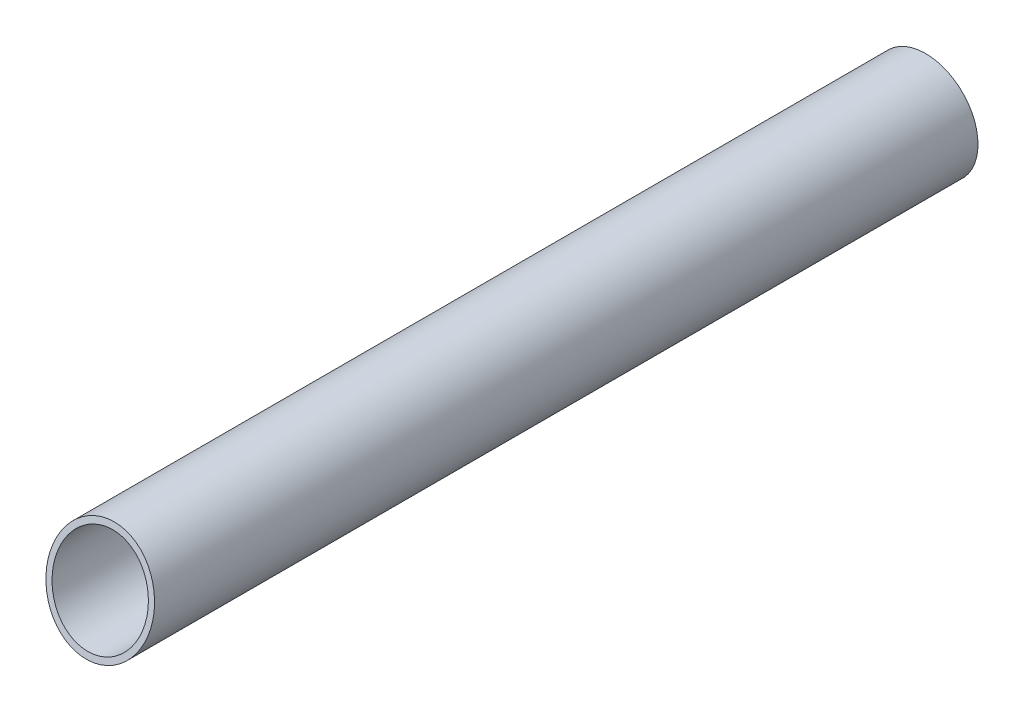
ISO-10303-21;
HEADER;
FILE_DESCRIPTION(('STEP AP214'),'2;1');
FILE_NAME('part.step','',(''),(''),'','','');
FILE_SCHEMA(('AUTOMOTIVE_DESIGN { 1 0 10303 214 1 1 1 1 }'));
ENDSEC;
DATA;
#1=APPLICATION_CONTEXT('core data for automotive mechanical design processes');
#2=APPLICATION_PROTOCOL_DEFINITION('international standard','automotive_design',2000,#1);
#3=PRODUCT_CONTEXT('',#1,'mechanical');
#4=PRODUCT('Part','Part','',(#3));
#5=PRODUCT_RELATED_PRODUCT_CATEGORY('part','',(#4));
#6=PRODUCT_DEFINITION_FORMATION('','',#4);
#7=PRODUCT_DEFINITION_CONTEXT('part definition',#1,'design');
#8=PRODUCT_DEFINITION('design','',#6,#7);
#9=PRODUCT_DEFINITION_SHAPE('','',#8);
#10=(LENGTH_UNIT() NAMED_UNIT(*) SI_UNIT(.MILLI.,.METRE.));
#11=(NAMED_UNIT(*) PLANE_ANGLE_UNIT() SI_UNIT($,.RADIAN.));
#12=(NAMED_UNIT(*) SI_UNIT($,.STERADIAN.) SOLID_ANGLE_UNIT());
#13=UNCERTAINTY_MEASURE_WITH_UNIT(LENGTH_MEASURE(1.E-05),#10,'distance_accuracy_value','');
#14=(GEOMETRIC_REPRESENTATION_CONTEXT(3) GLOBAL_UNCERTAINTY_ASSIGNED_CONTEXT((#13)) GLOBAL_UNIT_ASSIGNED_CONTEXT((#10,
#11,#12)) REPRESENTATION_CONTEXT('',''));
#15=CARTESIAN_POINT('',(0.,0.,0.));
#16=DIRECTION('',(0.,0.,1.));
#17=DIRECTION('',(1.,0.,0.));
#18=AXIS2_PLACEMENT_3D('',#15,#16,#17);
#19=CARTESIAN_POINT('',(0.,0.,152.4));
#20=DIRECTION('',(0.,0.,-1.));
#21=DIRECTION('',(0.,-1.,0.));
#22=AXIS2_PLACEMENT_3D('',#19,#20,#21);
#23=CYLINDRICAL_SURFACE('',#22,16.891);
#24=CARTESIAN_POINT('',(0.,0.,147.295567884187));
#25=DIRECTION('',(0.,-0.25881904510251,-0.965925826289071));
#26=DIRECTION('',(0.,0.965925826289071,-0.25881904510251));
#27=AXIS2_PLACEMENT_3D('',#24,#25,#26);
#28=ELLIPSE('',#27,17.4868499633067,16.891);
#29=CARTESIAN_POINT('',(0.,16.8910000000001,142.769638074833));
#30=VERTEX_POINT('',#29);
#31=EDGE_CURVE('E29',#30,#30,#28,.T.);
#32=ORIENTED_EDGE('',*,*,#31,.F.);
#33=EDGE_LOOP('',(#32));
#34=FACE_BOUND('',#33,.T.);
#35=CARTESIAN_POINT('',(0.,0.,-152.4));
#36=DIRECTION('',(0.,0.,1.));
#37=DIRECTION('',(1.,0.,0.));
#38=AXIS2_PLACEMENT_3D('',#35,#36,#37);
#39=CIRCLE('',#38,16.891);
#40=CARTESIAN_POINT('',(16.891,0.,-152.4));
#41=VERTEX_POINT('',#40);
#42=EDGE_CURVE('E25',#41,#41,#39,.T.);
#43=ORIENTED_EDGE('',*,*,#42,.F.);
#44=EDGE_LOOP('',(#43));
#45=FACE_BOUND('',#44,.T.);
#46=ADVANCED_FACE('F14',(#34,#45),#23,.F.);
#47=CARTESIAN_POINT('',(0.,0.,152.4));
#48=DIRECTION('',(0.,0.,-1.));
#49=DIRECTION('',(0.,-1.,0.));
#50=AXIS2_PLACEMENT_3D('',#47,#48,#49);
#51=CYLINDRICAL_SURFACE('',#50,19.05);
#52=CARTESIAN_POINT('',(0.,0.,147.295567884187));
#53=DIRECTION('',(0.,-0.25881904510251,-0.965925826289071));
#54=DIRECTION('',(0.,0.965925826289071,-0.25881904510251));
#55=AXIS2_PLACEMENT_3D('',#52,#53,#54);
#56=ELLIPSE('',#55,19.722011236812,19.05);
#57=CARTESIAN_POINT('',(0.,19.05,142.191135768375));
#58=VERTEX_POINT('',#57);
#59=EDGE_CURVE('E9',#58,#58,#56,.T.);
#60=ORIENTED_EDGE('',*,*,#59,.T.);
#61=EDGE_LOOP('',(#60));
#62=FACE_BOUND('',#61,.T.);
#63=CARTESIAN_POINT('',(0.,0.,-152.4));
#64=DIRECTION('',(0.,0.,1.));
#65=DIRECTION('',(1.,0.,0.));
#66=AXIS2_PLACEMENT_3D('',#63,#64,#65);
#67=CIRCLE('',#66,19.05);
#68=CARTESIAN_POINT('',(19.05,0.,-152.4));
#69=VERTEX_POINT('',#68);
#70=EDGE_CURVE('E18',#69,#69,#67,.T.);
#71=ORIENTED_EDGE('',*,*,#70,.T.);
#72=EDGE_LOOP('',(#71));
#73=FACE_BOUND('',#72,.T.);
#74=ADVANCED_FACE('F16',(#62,#73),#51,.T.);
#75=CARTESIAN_POINT('',(0.,0.,-152.4));
#76=DIRECTION('',(0.,0.,1.));
#77=DIRECTION('',(1.,0.,0.));
#78=AXIS2_PLACEMENT_3D('',#75,#76,#77);
#79=PLANE('',#78);
#80=ORIENTED_EDGE('',*,*,#70,.F.);
#81=EDGE_LOOP('',(#80));
#82=FACE_BOUND('',#81,.T.);
#83=ORIENTED_EDGE('',*,*,#42,.T.);
#84=EDGE_LOOP('',(#83));
#85=FACE_BOUND('',#84,.T.);
#86=ADVANCED_FACE('F39',(#82,#85),#79,.F.);
#87=CARTESIAN_POINT('',(-19.05,-19.05,152.4));
#88=DIRECTION('',(0.,-0.25881904510251,-0.965925826289071));
#89=DIRECTION('',(0.,0.965925826289071,-0.25881904510251));
#90=AXIS2_PLACEMENT_3D('',#87,#88,#89);
#91=PLANE('',#90);
#92=ORIENTED_EDGE('',*,*,#59,.F.);
#93=EDGE_LOOP('',(#92));
#94=FACE_BOUND('',#93,.T.);
#95=ORIENTED_EDGE('',*,*,#31,.T.);
#96=EDGE_LOOP('',(#95));
#97=FACE_BOUND('',#96,.T.);
#98=ADVANCED_FACE('F33',(#94,#97),#91,.F.);
#99=CLOSED_SHELL('',(#46,#74,#86,#98));
#100=MANIFOLD_SOLID_BREP('B1',#99);
#101=ADVANCED_BREP_SHAPE_REPRESENTATION('',(#18,#100),#14);
#102=SHAPE_DEFINITION_REPRESENTATION(#9,#101);
ENDSEC;
END-ISO-10303-21;
